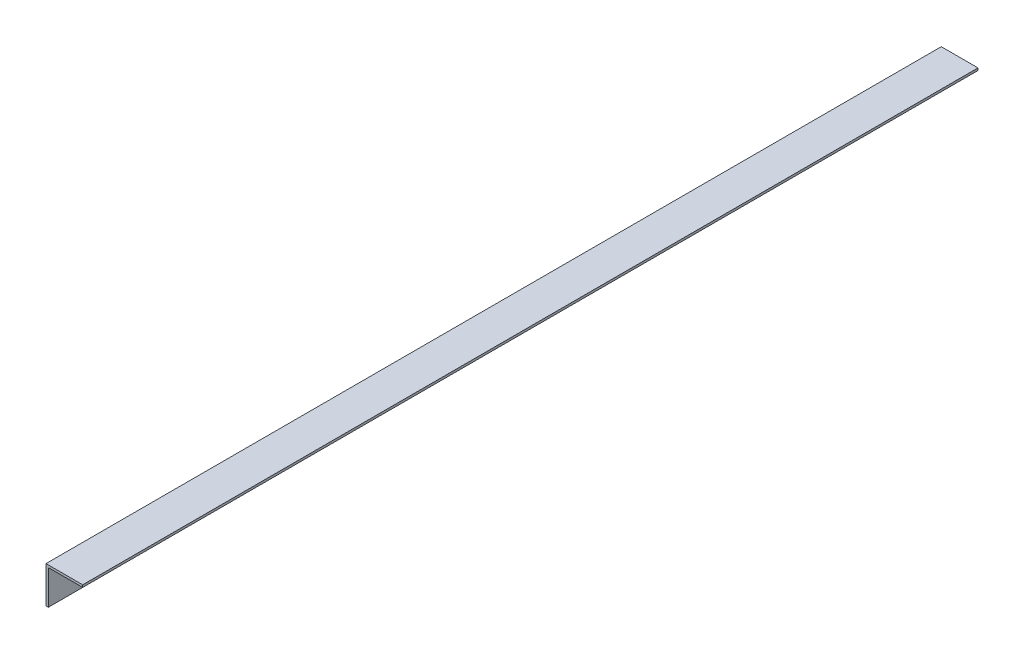
ISO-10303-21;
HEADER;
FILE_DESCRIPTION(('STEP AP214'),'2;1');
FILE_NAME('part.step','',(''),(''),'','','');
FILE_SCHEMA(('AUTOMOTIVE_DESIGN { 1 0 10303 214 1 1 1 1 }'));
ENDSEC;
DATA;
#1=APPLICATION_CONTEXT('core data for automotive mechanical design processes');
#2=APPLICATION_PROTOCOL_DEFINITION('international standard','automotive_design',2000,#1);
#3=PRODUCT_CONTEXT('',#1,'mechanical');
#4=PRODUCT('Part','Part','',(#3));
#5=PRODUCT_RELATED_PRODUCT_CATEGORY('part','',(#4));
#6=PRODUCT_DEFINITION_FORMATION('','',#4);
#7=PRODUCT_DEFINITION_CONTEXT('part definition',#1,'design');
#8=PRODUCT_DEFINITION('design','',#6,#7);
#9=PRODUCT_DEFINITION_SHAPE('','',#8);
#10=(LENGTH_UNIT() NAMED_UNIT(*) SI_UNIT(.MILLI.,.METRE.));
#11=(NAMED_UNIT(*) PLANE_ANGLE_UNIT() SI_UNIT($,.RADIAN.));
#12=(NAMED_UNIT(*) SI_UNIT($,.STERADIAN.) SOLID_ANGLE_UNIT());
#13=UNCERTAINTY_MEASURE_WITH_UNIT(LENGTH_MEASURE(1.E-05),#10,'distance_accuracy_value','');
#14=(GEOMETRIC_REPRESENTATION_CONTEXT(3) GLOBAL_UNCERTAINTY_ASSIGNED_CONTEXT((#13)) GLOBAL_UNIT_ASSIGNED_CONTEXT((#10,
#11,#12)) REPRESENTATION_CONTEXT('',''));
#15=CARTESIAN_POINT('',(0.,0.,0.));
#16=DIRECTION('',(0.,0.,1.));
#17=DIRECTION('',(1.,0.,0.));
#18=AXIS2_PLACEMENT_3D('',#15,#16,#17);
#19=CARTESIAN_POINT('',(38.,1154.,-800.));
#20=DIRECTION('',(-1.,0.,0.));
#21=DIRECTION('',(0.,0.,1.));
#22=AXIS2_PLACEMENT_3D('',#19,#20,#21);
#23=PLANE('',#22);
#24=DIRECTION('',(0.,-1.,0.));
#25=VECTOR('',#24,1.);
#26=CARTESIAN_POINT('',(38.,1154.,-20.));
#27=LINE('',#26,#25);
#28=CARTESIAN_POINT('',(38.,1154.,-20.));
#29=VERTEX_POINT('',#28);
#30=CARTESIAN_POINT('',(38.,1122.,-20.));
#31=VERTEX_POINT('',#30);
#32=EDGE_CURVE('E124',#29,#31,#27,.T.);
#33=ORIENTED_EDGE('',*,*,#32,.F.);
#34=DIRECTION('',(0.,0.,1.));
#35=VECTOR('',#34,1.);
#36=CARTESIAN_POINT('',(38.,1154.,-800.));
#37=LINE('',#36,#35);
#38=CARTESIAN_POINT('',(38.,1154.,-800.));
#39=VERTEX_POINT('',#38);
#40=EDGE_CURVE('E11',#39,#29,#37,.T.);
#41=ORIENTED_EDGE('',*,*,#40,.F.);
#42=DIRECTION('',(0.,-1.,0.));
#43=VECTOR('',#42,1.);
#44=CARTESIAN_POINT('',(38.,1154.,-800.));
#45=LINE('',#44,#43);
#46=CARTESIAN_POINT('',(38.,1122.,-800.));
#47=VERTEX_POINT('',#46);
#48=EDGE_CURVE('E138',#39,#47,#45,.T.);
#49=ORIENTED_EDGE('',*,*,#48,.T.);
#50=DIRECTION('',(0.,0.,1.));
#51=VECTOR('',#50,1.);
#52=CARTESIAN_POINT('',(38.,1122.,-800.));
#53=LINE('',#52,#51);
#54=EDGE_CURVE('E42',#47,#31,#53,.T.);
#55=ORIENTED_EDGE('',*,*,#54,.T.);
#56=EDGE_LOOP('',(#33,#41,#49,#55));
#57=FACE_BOUND('',#56,.T.);
#58=ADVANCED_FACE('F39',(#57),#23,.T.);
#59=CARTESIAN_POINT('',(70.,1154.,-800.));
#60=DIRECTION('',(0.,1.,0.));
#61=DIRECTION('',(0.,0.,1.));
#62=AXIS2_PLACEMENT_3D('',#59,#60,#61);
#63=PLANE('',#62);
#64=DIRECTION('',(-1.,0.,0.));
#65=VECTOR('',#64,1.);
#66=CARTESIAN_POINT('',(70.,1154.,-20.));
#67=LINE('',#66,#65);
#68=CARTESIAN_POINT('',(70.,1154.,-20.));
#69=VERTEX_POINT('',#68);
#70=EDGE_CURVE('E136',#69,#29,#67,.T.);
#71=ORIENTED_EDGE('',*,*,#70,.F.);
#72=DIRECTION('',(0.,0.,1.));
#73=VECTOR('',#72,1.);
#74=CARTESIAN_POINT('',(70.,1154.,-800.));
#75=LINE('',#74,#73);
#76=CARTESIAN_POINT('',(70.,1154.,-800.));
#77=VERTEX_POINT('',#76);
#78=EDGE_CURVE('E48',#77,#69,#75,.T.);
#79=ORIENTED_EDGE('',*,*,#78,.F.);
#80=DIRECTION('',(-1.,0.,0.));
#81=VECTOR('',#80,1.);
#82=CARTESIAN_POINT('',(70.,1154.,-800.));
#83=LINE('',#82,#81);
#84=EDGE_CURVE('E114',#77,#39,#83,.T.);
#85=ORIENTED_EDGE('',*,*,#84,.T.);
#86=ORIENTED_EDGE('',*,*,#40,.T.);
#87=EDGE_LOOP('',(#71,#79,#85,#86));
#88=FACE_BOUND('',#87,.T.);
#89=ADVANCED_FACE('F146',(#88),#63,.T.);
#90=CARTESIAN_POINT('',(70.,1152.,-800.));
#91=DIRECTION('',(1.,0.,0.));
#92=DIRECTION('',(0.,0.,-1.));
#93=AXIS2_PLACEMENT_3D('',#90,#91,#92);
#94=PLANE('',#93);
#95=DIRECTION('',(0.,1.,0.));
#96=VECTOR('',#95,1.);
#97=CARTESIAN_POINT('',(70.,1152.,-20.));
#98=LINE('',#97,#96);
#99=CARTESIAN_POINT('',(70.,1152.,-20.));
#100=VERTEX_POINT('',#99);
#101=EDGE_CURVE('E101',#100,#69,#98,.T.);
#102=ORIENTED_EDGE('',*,*,#101,.F.);
#103=DIRECTION('',(0.,0.,1.));
#104=VECTOR('',#103,1.);
#105=CARTESIAN_POINT('',(70.,1152.,-800.));
#106=LINE('',#105,#104);
#107=CARTESIAN_POINT('',(70.,1152.,-800.));
#108=VERTEX_POINT('',#107);
#109=EDGE_CURVE('E96',#108,#100,#106,.T.);
#110=ORIENTED_EDGE('',*,*,#109,.F.);
#111=DIRECTION('',(0.,1.,0.));
#112=VECTOR('',#111,1.);
#113=CARTESIAN_POINT('',(70.,1152.,-800.));
#114=LINE('',#113,#112);
#115=EDGE_CURVE('E99',#108,#77,#114,.T.);
#116=ORIENTED_EDGE('',*,*,#115,.T.);
#117=ORIENTED_EDGE('',*,*,#78,.T.);
#118=EDGE_LOOP('',(#102,#110,#116,#117));
#119=FACE_BOUND('',#118,.T.);
#120=ADVANCED_FACE('F98',(#119),#94,.T.);
#121=CARTESIAN_POINT('',(40.,1152.,-800.));
#122=DIRECTION('',(0.,-1.,0.));
#123=DIRECTION('',(0.,0.,-1.));
#124=AXIS2_PLACEMENT_3D('',#121,#122,#123);
#125=PLANE('',#124);
#126=DIRECTION('',(1.,0.,0.));
#127=VECTOR('',#126,1.);
#128=CARTESIAN_POINT('',(40.,1152.,-20.));
#129=LINE('',#128,#127);
#130=CARTESIAN_POINT('',(40.,1152.,-20.));
#131=VERTEX_POINT('',#130);
#132=EDGE_CURVE('E133',#131,#100,#129,.T.);
#133=ORIENTED_EDGE('',*,*,#132,.F.);
#134=DIRECTION('',(0.,0.,1.));
#135=VECTOR('',#134,1.);
#136=CARTESIAN_POINT('',(40.,1152.,-800.));
#137=LINE('',#136,#135);
#138=CARTESIAN_POINT('',(40.,1152.,-800.));
#139=VERTEX_POINT('',#138);
#140=EDGE_CURVE('E106',#139,#131,#137,.T.);
#141=ORIENTED_EDGE('',*,*,#140,.F.);
#142=DIRECTION('',(1.,0.,0.));
#143=VECTOR('',#142,1.);
#144=CARTESIAN_POINT('',(40.,1152.,-800.));
#145=LINE('',#144,#143);
#146=EDGE_CURVE('E112',#139,#108,#145,.T.);
#147=ORIENTED_EDGE('',*,*,#146,.T.);
#148=ORIENTED_EDGE('',*,*,#109,.T.);
#149=EDGE_LOOP('',(#133,#141,#147,#148));
#150=FACE_BOUND('',#149,.T.);
#151=ADVANCED_FACE('F116',(#150),#125,.T.);
#152=CARTESIAN_POINT('',(40.,1122.,-800.));
#153=DIRECTION('',(1.,0.,0.));
#154=DIRECTION('',(0.,0.,-1.));
#155=AXIS2_PLACEMENT_3D('',#152,#153,#154);
#156=PLANE('',#155);
#157=DIRECTION('',(0.,1.,0.));
#158=VECTOR('',#157,1.);
#159=CARTESIAN_POINT('',(40.,1122.,-20.));
#160=LINE('',#159,#158);
#161=CARTESIAN_POINT('',(40.,1122.,-20.));
#162=VERTEX_POINT('',#161);
#163=EDGE_CURVE('E130',#162,#131,#160,.T.);
#164=ORIENTED_EDGE('',*,*,#163,.F.);
#165=DIRECTION('',(0.,0.,1.));
#166=VECTOR('',#165,1.);
#167=CARTESIAN_POINT('',(40.,1122.,-800.));
#168=LINE('',#167,#166);
#169=CARTESIAN_POINT('',(40.,1122.,-800.));
#170=VERTEX_POINT('',#169);
#171=EDGE_CURVE('E141',#170,#162,#168,.T.);
#172=ORIENTED_EDGE('',*,*,#171,.F.);
#173=DIRECTION('',(0.,1.,0.));
#174=VECTOR('',#173,1.);
#175=CARTESIAN_POINT('',(40.,1122.,-800.));
#176=LINE('',#175,#174);
#177=EDGE_CURVE('E117',#170,#139,#176,.T.);
#178=ORIENTED_EDGE('',*,*,#177,.T.);
#179=ORIENTED_EDGE('',*,*,#140,.T.);
#180=EDGE_LOOP('',(#164,#172,#178,#179));
#181=FACE_BOUND('',#180,.T.);
#182=ADVANCED_FACE('F159',(#181),#156,.T.);
#183=CARTESIAN_POINT('',(38.,1122.,-800.));
#184=DIRECTION('',(0.,-1.,0.));
#185=DIRECTION('',(0.,0.,-1.));
#186=AXIS2_PLACEMENT_3D('',#183,#184,#185);
#187=PLANE('',#186);
#188=DIRECTION('',(1.,0.,0.));
#189=VECTOR('',#188,1.);
#190=CARTESIAN_POINT('',(38.,1122.,-20.));
#191=LINE('',#190,#189);
#192=EDGE_CURVE('E127',#31,#162,#191,.T.);
#193=ORIENTED_EDGE('',*,*,#192,.F.);
#194=ORIENTED_EDGE('',*,*,#54,.F.);
#195=DIRECTION('',(1.,0.,0.));
#196=VECTOR('',#195,1.);
#197=CARTESIAN_POINT('',(38.,1122.,-800.));
#198=LINE('',#197,#196);
#199=EDGE_CURVE('E119',#47,#170,#198,.T.);
#200=ORIENTED_EDGE('',*,*,#199,.T.);
#201=ORIENTED_EDGE('',*,*,#171,.T.);
#202=EDGE_LOOP('',(#193,#194,#200,#201));
#203=FACE_BOUND('',#202,.T.);
#204=ADVANCED_FACE('F143',(#203),#187,.T.);
#205=CARTESIAN_POINT('',(0.,0.,-800.));
#206=DIRECTION('',(0.,0.,1.));
#207=DIRECTION('',(1.,0.,0.));
#208=AXIS2_PLACEMENT_3D('',#205,#206,#207);
#209=PLANE('',#208);
#210=ORIENTED_EDGE('',*,*,#48,.F.);
#211=ORIENTED_EDGE('',*,*,#84,.F.);
#212=ORIENTED_EDGE('',*,*,#115,.F.);
#213=ORIENTED_EDGE('',*,*,#146,.F.);
#214=ORIENTED_EDGE('',*,*,#177,.F.);
#215=ORIENTED_EDGE('',*,*,#199,.F.);
#216=EDGE_LOOP('',(#210,#211,#212,#213,#214,#215));
#217=FACE_BOUND('',#216,.T.);
#218=ADVANCED_FACE('F110',(#217),#209,.F.);
#219=CARTESIAN_POINT('',(0.,0.,-20.));
#220=DIRECTION('',(0.,0.,1.));
#221=DIRECTION('',(1.,0.,0.));
#222=AXIS2_PLACEMENT_3D('',#219,#220,#221);
#223=PLANE('',#222);
#224=ORIENTED_EDGE('',*,*,#32,.T.);
#225=ORIENTED_EDGE('',*,*,#192,.T.);
#226=ORIENTED_EDGE('',*,*,#163,.T.);
#227=ORIENTED_EDGE('',*,*,#132,.T.);
#228=ORIENTED_EDGE('',*,*,#101,.T.);
#229=ORIENTED_EDGE('',*,*,#70,.T.);
#230=EDGE_LOOP('',(#224,#225,#226,#227,#228,#229));
#231=FACE_BOUND('',#230,.T.);
#232=ADVANCED_FACE('F145',(#231),#223,.T.);
#233=CLOSED_SHELL('',(#58,#89,#120,#151,#182,#204,#218,#232));
#234=MANIFOLD_SOLID_BREP('B2',#233);
#235=ADVANCED_BREP_SHAPE_REPRESENTATION('',(#18,#234),#14);
#236=SHAPE_DEFINITION_REPRESENTATION(#9,#235);
ENDSEC;
END-ISO-10303-21;
